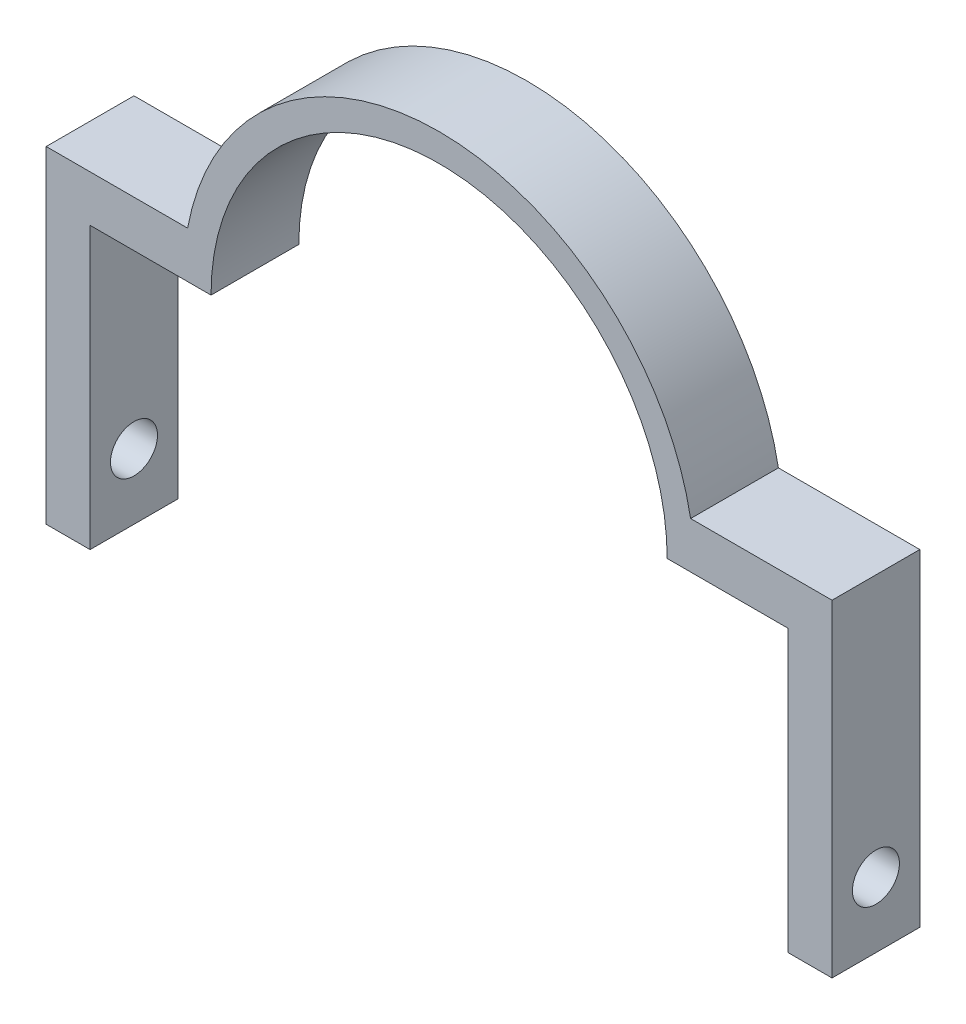
ISO-10303-21;
HEADER;
FILE_DESCRIPTION(('STEP AP214'),'2;1');
FILE_NAME('part.step','',(''),(''),'','','');
FILE_SCHEMA(('AUTOMOTIVE_DESIGN { 1 0 10303 214 1 1 1 1 }'));
ENDSEC;
DATA;
#1=APPLICATION_CONTEXT('core data for automotive mechanical design processes');
#2=APPLICATION_PROTOCOL_DEFINITION('international standard','automotive_design',2000,#1);
#3=PRODUCT_CONTEXT('',#1,'mechanical');
#4=PRODUCT('Part','Part','',(#3));
#5=PRODUCT_RELATED_PRODUCT_CATEGORY('part','',(#4));
#6=PRODUCT_DEFINITION_FORMATION('','',#4);
#7=PRODUCT_DEFINITION_CONTEXT('part definition',#1,'design');
#8=PRODUCT_DEFINITION('design','',#6,#7);
#9=PRODUCT_DEFINITION_SHAPE('','',#8);
#10=(LENGTH_UNIT() NAMED_UNIT(*) SI_UNIT(.MILLI.,.METRE.));
#11=(NAMED_UNIT(*) PLANE_ANGLE_UNIT() SI_UNIT($,.RADIAN.));
#12=(NAMED_UNIT(*) SI_UNIT($,.STERADIAN.) SOLID_ANGLE_UNIT());
#13=UNCERTAINTY_MEASURE_WITH_UNIT(LENGTH_MEASURE(1.E-05),#10,'distance_accuracy_value','');
#14=(GEOMETRIC_REPRESENTATION_CONTEXT(3) GLOBAL_UNCERTAINTY_ASSIGNED_CONTEXT((#13)) GLOBAL_UNIT_ASSIGNED_CONTEXT((#10,
#11,#12)) REPRESENTATION_CONTEXT('',''));
#15=CARTESIAN_POINT('',(0.,0.,0.));
#16=DIRECTION('',(0.,0.,1.));
#17=DIRECTION('',(1.,0.,0.));
#18=AXIS2_PLACEMENT_3D('',#15,#16,#17);
#19=CARTESIAN_POINT('',(-28.4249952,-20.32,6.35));
#20=DIRECTION('',(1.,0.,0.));
#21=DIRECTION('',(0.,1.,0.));
#22=AXIS2_PLACEMENT_3D('',#19,#20,#21);
#23=PLANE('',#22);
#24=CARTESIAN_POINT('',(-28.4249952,-15.5878422506403,3.175));
#25=DIRECTION('',(1.,0.,0.));
#26=DIRECTION('',(0.,1.,0.));
#27=AXIS2_PLACEMENT_3D('',#24,#25,#26);
#28=CIRCLE('',#27,1.700000029);
#29=CARTESIAN_POINT('',(-28.4249952,-13.8878422216403,3.175));
#30=VERTEX_POINT('',#29);
#31=EDGE_CURVE('E265',#30,#30,#28,.T.);
#32=ORIENTED_EDGE('',*,*,#31,.T.);
#33=EDGE_LOOP('',(#32));
#34=FACE_BOUND('',#33,.T.);
#35=DIRECTION('',(0.,-1.,0.));
#36=VECTOR('',#35,1.);
#37=CARTESIAN_POINT('',(-28.4249952,-20.32,0.));
#38=LINE('',#37,#36);
#39=CARTESIAN_POINT('',(-28.4249952,3.35014374935966,0.));
#40=VERTEX_POINT('',#39);
#41=CARTESIAN_POINT('',(-28.4249952,-20.32,0.));
#42=VERTEX_POINT('',#41);
#43=EDGE_CURVE('E157',#40,#42,#38,.T.);
#44=ORIENTED_EDGE('',*,*,#43,.T.);
#45=DIRECTION('',(0.,0.,-1.));
#46=VECTOR('',#45,1.);
#47=CARTESIAN_POINT('',(-28.4249952,-20.32,6.35));
#48=LINE('',#47,#46);
#49=CARTESIAN_POINT('',(-28.4249952,-20.32,6.35));
#50=VERTEX_POINT('',#49);
#51=EDGE_CURVE('E11',#50,#42,#48,.T.);
#52=ORIENTED_EDGE('',*,*,#51,.F.);
#53=DIRECTION('',(0.,-1.,0.));
#54=VECTOR('',#53,1.);
#55=CARTESIAN_POINT('',(-28.4249952,-20.32,6.35));
#56=LINE('',#55,#54);
#57=CARTESIAN_POINT('',(-28.4249952,3.35014374935966,6.35));
#58=VERTEX_POINT('',#57);
#59=EDGE_CURVE('E180',#58,#50,#56,.T.);
#60=ORIENTED_EDGE('',*,*,#59,.F.);
#61=DIRECTION('',(0.,0.,-1.));
#62=VECTOR('',#61,1.);
#63=CARTESIAN_POINT('',(-28.4249952,3.35014374935966,6.35));
#64=LINE('',#63,#62);
#65=EDGE_CURVE('E153',#58,#40,#64,.T.);
#66=ORIENTED_EDGE('',*,*,#65,.T.);
#67=EDGE_LOOP('',(#44,#52,#60,#66));
#68=FACE_BOUND('',#67,.T.);
#69=ADVANCED_FACE('F37',(#34,#68),#23,.F.);
#70=CARTESIAN_POINT('',(-25.2499952,-20.32,6.35));
#71=DIRECTION('',(0.,1.,0.));
#72=DIRECTION('',(0.,0.,1.));
#73=AXIS2_PLACEMENT_3D('',#70,#71,#72);
#74=PLANE('',#73);
#75=DIRECTION('',(1.,0.,0.));
#76=VECTOR('',#75,1.);
#77=CARTESIAN_POINT('',(-25.2499952,-20.32,0.));
#78=LINE('',#77,#76);
#79=CARTESIAN_POINT('',(-25.2499952,-20.32,0.));
#80=VERTEX_POINT('',#79);
#81=EDGE_CURVE('E160',#42,#80,#78,.T.);
#82=ORIENTED_EDGE('',*,*,#81,.T.);
#83=DIRECTION('',(0.,0.,-1.));
#84=VECTOR('',#83,1.);
#85=CARTESIAN_POINT('',(-25.2499952,-20.32,6.35));
#86=LINE('',#85,#84);
#87=CARTESIAN_POINT('',(-25.2499952,-20.32,6.35));
#88=VERTEX_POINT('',#87);
#89=EDGE_CURVE('E45',#88,#80,#86,.T.);
#90=ORIENTED_EDGE('',*,*,#89,.F.);
#91=DIRECTION('',(1.,0.,0.));
#92=VECTOR('',#91,1.);
#93=CARTESIAN_POINT('',(-25.2499952,-20.32,6.35));
#94=LINE('',#93,#92);
#95=EDGE_CURVE('E108',#50,#88,#94,.T.);
#96=ORIENTED_EDGE('',*,*,#95,.F.);
#97=ORIENTED_EDGE('',*,*,#51,.T.);
#98=EDGE_LOOP('',(#82,#90,#96,#97));
#99=FACE_BOUND('',#98,.T.);
#100=ADVANCED_FACE('F258',(#99),#74,.F.);
#101=CARTESIAN_POINT('',(-25.2499952,0.,6.35));
#102=DIRECTION('',(-1.,0.,0.));
#103=DIRECTION('',(0.,-1.,0.));
#104=AXIS2_PLACEMENT_3D('',#101,#102,#103);
#105=PLANE('',#104);
#106=CARTESIAN_POINT('',(-25.2499952,-15.5878422506403,3.175));
#107=DIRECTION('',(-1.,0.,0.));
#108=DIRECTION('',(0.,-1.,0.));
#109=AXIS2_PLACEMENT_3D('',#106,#107,#108);
#110=CIRCLE('',#109,1.700000029);
#111=CARTESIAN_POINT('',(-25.2499952,-17.2878422796403,3.175));
#112=VERTEX_POINT('',#111);
#113=EDGE_CURVE('E161',#112,#112,#110,.T.);
#114=ORIENTED_EDGE('',*,*,#113,.T.);
#115=EDGE_LOOP('',(#114));
#116=FACE_BOUND('',#115,.T.);
#117=DIRECTION('',(0.,1.,0.));
#118=VECTOR('',#117,1.);
#119=CARTESIAN_POINT('',(-25.2499952,0.,0.));
#120=LINE('',#119,#118);
#121=CARTESIAN_POINT('',(-25.2499952,0.,0.));
#122=VERTEX_POINT('',#121);
#123=EDGE_CURVE('E163',#80,#122,#120,.T.);
#124=ORIENTED_EDGE('',*,*,#123,.T.);
#125=DIRECTION('',(0.,0.,-1.));
#126=VECTOR('',#125,1.);
#127=CARTESIAN_POINT('',(-25.2499952,0.,6.35));
#128=LINE('',#127,#126);
#129=CARTESIAN_POINT('',(-25.2499952,0.,6.35));
#130=VERTEX_POINT('',#129);
#131=EDGE_CURVE('E199',#130,#122,#128,.T.);
#132=ORIENTED_EDGE('',*,*,#131,.F.);
#133=DIRECTION('',(0.,1.,0.));
#134=VECTOR('',#133,1.);
#135=CARTESIAN_POINT('',(-25.2499952,0.,6.35));
#136=LINE('',#135,#134);
#137=EDGE_CURVE('E207',#88,#130,#136,.T.);
#138=ORIENTED_EDGE('',*,*,#137,.F.);
#139=ORIENTED_EDGE('',*,*,#89,.T.);
#140=EDGE_LOOP('',(#124,#132,#138,#139));
#141=FACE_BOUND('',#140,.T.);
#142=ADVANCED_FACE('F205',(#116,#141),#105,.F.);
#143=CARTESIAN_POINT('',(-16.5,0.,6.35));
#144=DIRECTION('',(0.,1.,0.));
#145=DIRECTION('',(-1.,0.,0.));
#146=AXIS2_PLACEMENT_3D('',#143,#144,#145);
#147=PLANE('',#146);
#148=DIRECTION('',(1.,0.,0.));
#149=VECTOR('',#148,1.);
#150=CARTESIAN_POINT('',(-16.5,0.,0.));
#151=LINE('',#150,#149);
#152=CARTESIAN_POINT('',(-16.5,0.,0.));
#153=VERTEX_POINT('',#152);
#154=EDGE_CURVE('E165',#122,#153,#151,.T.);
#155=ORIENTED_EDGE('',*,*,#154,.T.);
#156=DIRECTION('',(0.,0.,-1.));
#157=VECTOR('',#156,1.);
#158=CARTESIAN_POINT('',(-16.5,0.,6.35));
#159=LINE('',#158,#157);
#160=CARTESIAN_POINT('',(-16.5,0.,6.35));
#161=VERTEX_POINT('',#160);
#162=EDGE_CURVE('E196',#161,#153,#159,.T.);
#163=ORIENTED_EDGE('',*,*,#162,.F.);
#164=DIRECTION('',(1.,0.,0.));
#165=VECTOR('',#164,1.);
#166=CARTESIAN_POINT('',(-16.5,0.,6.35));
#167=LINE('',#166,#165);
#168=EDGE_CURVE('E225',#130,#161,#167,.T.);
#169=ORIENTED_EDGE('',*,*,#168,.F.);
#170=ORIENTED_EDGE('',*,*,#131,.T.);
#171=EDGE_LOOP('',(#155,#163,#169,#170));
#172=FACE_BOUND('',#171,.T.);
#173=ADVANCED_FACE('F216',(#172),#147,.F.);
#174=CARTESIAN_POINT('',(0.,0.,6.35));
#175=DIRECTION('',(0.,0.,-1.));
#176=DIRECTION('',(-1.,0.,0.));
#177=AXIS2_PLACEMENT_3D('',#174,#175,#176);
#178=CYLINDRICAL_SURFACE('',#177,16.5);
#179=CARTESIAN_POINT('',(0.,0.,0.));
#180=DIRECTION('',(0.,0.,-1.));
#181=DIRECTION('',(1.,0.,0.));
#182=AXIS2_PLACEMENT_3D('',#179,#180,#181);
#183=CIRCLE('',#182,16.5);
#184=CARTESIAN_POINT('',(16.5,0.,0.));
#185=VERTEX_POINT('',#184);
#186=EDGE_CURVE('E167',#153,#185,#183,.T.);
#187=ORIENTED_EDGE('',*,*,#186,.T.);
#188=DIRECTION('',(0.,0.,-1.));
#189=VECTOR('',#188,1.);
#190=CARTESIAN_POINT('',(16.5,0.,6.35));
#191=LINE('',#190,#189);
#192=CARTESIAN_POINT('',(16.5,0.,6.35));
#193=VERTEX_POINT('',#192);
#194=EDGE_CURVE('E193',#193,#185,#191,.T.);
#195=ORIENTED_EDGE('',*,*,#194,.F.);
#196=CARTESIAN_POINT('',(0.,0.,6.35));
#197=DIRECTION('',(0.,0.,-1.));
#198=DIRECTION('',(1.,0.,0.));
#199=AXIS2_PLACEMENT_3D('',#196,#197,#198);
#200=CIRCLE('',#199,16.5);
#201=EDGE_CURVE('E222',#161,#193,#200,.T.);
#202=ORIENTED_EDGE('',*,*,#201,.F.);
#203=ORIENTED_EDGE('',*,*,#162,.T.);
#204=EDGE_LOOP('',(#187,#195,#202,#203));
#205=FACE_BOUND('',#204,.T.);
#206=ADVANCED_FACE('F220',(#205),#178,.F.);
#207=CARTESIAN_POINT('',(16.5,0.,6.35));
#208=DIRECTION('',(0.,1.,0.));
#209=DIRECTION('',(-1.,0.,0.));
#210=AXIS2_PLACEMENT_3D('',#207,#208,#209);
#211=PLANE('',#210);
#212=DIRECTION('',(1.,0.,0.));
#213=VECTOR('',#212,1.);
#214=CARTESIAN_POINT('',(16.5,0.,0.));
#215=LINE('',#214,#213);
#216=CARTESIAN_POINT('',(25.2499952,0.,0.));
#217=VERTEX_POINT('',#216);
#218=EDGE_CURVE('E169',#185,#217,#215,.T.);
#219=ORIENTED_EDGE('',*,*,#218,.T.);
#220=DIRECTION('',(0.,0.,-1.));
#221=VECTOR('',#220,1.);
#222=CARTESIAN_POINT('',(25.2499952,0.,6.35));
#223=LINE('',#222,#221);
#224=CARTESIAN_POINT('',(25.2499952,0.,6.35));
#225=VERTEX_POINT('',#224);
#226=EDGE_CURVE('E190',#225,#217,#223,.T.);
#227=ORIENTED_EDGE('',*,*,#226,.F.);
#228=DIRECTION('',(1.,0.,0.));
#229=VECTOR('',#228,1.);
#230=CARTESIAN_POINT('',(16.5,0.,6.35));
#231=LINE('',#230,#229);
#232=EDGE_CURVE('E224',#193,#225,#231,.T.);
#233=ORIENTED_EDGE('',*,*,#232,.F.);
#234=ORIENTED_EDGE('',*,*,#194,.T.);
#235=EDGE_LOOP('',(#219,#227,#233,#234));
#236=FACE_BOUND('',#235,.T.);
#237=ADVANCED_FACE('F363',(#236),#211,.F.);
#238=CARTESIAN_POINT('',(25.2499952,0.,6.35));
#239=DIRECTION('',(1.,0.,0.));
#240=DIRECTION('',(0.,1.,0.));
#241=AXIS2_PLACEMENT_3D('',#238,#239,#240);
#242=PLANE('',#241);
#243=CARTESIAN_POINT('',(25.2499952,-15.5878422506403,3.175));
#244=DIRECTION('',(1.,0.,0.));
#245=DIRECTION('',(0.,1.,0.));
#246=AXIS2_PLACEMENT_3D('',#243,#244,#245);
#247=CIRCLE('',#246,1.700000029);
#248=CARTESIAN_POINT('',(25.2499952,-13.8878422216403,3.175));
#249=VERTEX_POINT('',#248);
#250=EDGE_CURVE('E267',#249,#249,#247,.T.);
#251=ORIENTED_EDGE('',*,*,#250,.T.);
#252=EDGE_LOOP('',(#251));
#253=FACE_BOUND('',#252,.T.);
#254=DIRECTION('',(0.,-1.,0.));
#255=VECTOR('',#254,1.);
#256=CARTESIAN_POINT('',(25.2499952,0.,0.));
#257=LINE('',#256,#255);
#258=CARTESIAN_POINT('',(25.2499952,-20.32,0.));
#259=VERTEX_POINT('',#258);
#260=EDGE_CURVE('E171',#217,#259,#257,.T.);
#261=ORIENTED_EDGE('',*,*,#260,.T.);
#262=DIRECTION('',(0.,0.,-1.));
#263=VECTOR('',#262,1.);
#264=CARTESIAN_POINT('',(25.2499952,-20.32,6.35));
#265=LINE('',#264,#263);
#266=CARTESIAN_POINT('',(25.2499952,-20.32,6.35));
#267=VERTEX_POINT('',#266);
#268=EDGE_CURVE('E187',#267,#259,#265,.T.);
#269=ORIENTED_EDGE('',*,*,#268,.F.);
#270=DIRECTION('',(0.,-1.,0.));
#271=VECTOR('',#270,1.);
#272=CARTESIAN_POINT('',(25.2499952,0.,6.35));
#273=LINE('',#272,#271);
#274=EDGE_CURVE('E227',#225,#267,#273,.T.);
#275=ORIENTED_EDGE('',*,*,#274,.F.);
#276=ORIENTED_EDGE('',*,*,#226,.T.);
#277=EDGE_LOOP('',(#261,#269,#275,#276));
#278=FACE_BOUND('',#277,.T.);
#279=ADVANCED_FACE('F354',(#253,#278),#242,.F.);
#280=CARTESIAN_POINT('',(25.2499952,-20.32,6.35));
#281=DIRECTION('',(0.,1.,0.));
#282=DIRECTION('',(0.,0.,1.));
#283=AXIS2_PLACEMENT_3D('',#280,#281,#282);
#284=PLANE('',#283);
#285=DIRECTION('',(1.,0.,0.));
#286=VECTOR('',#285,1.);
#287=CARTESIAN_POINT('',(25.2499952,-20.32,0.));
#288=LINE('',#287,#286);
#289=CARTESIAN_POINT('',(28.4249952,-20.32,0.));
#290=VERTEX_POINT('',#289);
#291=EDGE_CURVE('E173',#259,#290,#288,.T.);
#292=ORIENTED_EDGE('',*,*,#291,.T.);
#293=DIRECTION('',(0.,0.,-1.));
#294=VECTOR('',#293,1.);
#295=CARTESIAN_POINT('',(28.4249952,-20.32,6.35));
#296=LINE('',#295,#294);
#297=CARTESIAN_POINT('',(28.4249952,-20.32,6.35));
#298=VERTEX_POINT('',#297);
#299=EDGE_CURVE('E184',#298,#290,#296,.T.);
#300=ORIENTED_EDGE('',*,*,#299,.F.);
#301=DIRECTION('',(1.,0.,0.));
#302=VECTOR('',#301,1.);
#303=CARTESIAN_POINT('',(25.2499952,-20.32,6.35));
#304=LINE('',#303,#302);
#305=EDGE_CURVE('E233',#267,#298,#304,.T.);
#306=ORIENTED_EDGE('',*,*,#305,.F.);
#307=ORIENTED_EDGE('',*,*,#268,.T.);
#308=EDGE_LOOP('',(#292,#300,#306,#307));
#309=FACE_BOUND('',#308,.T.);
#310=ADVANCED_FACE('F239',(#309),#284,.F.);
#311=CARTESIAN_POINT('',(28.4249952,-20.32,6.35));
#312=DIRECTION('',(-1.,0.,0.));
#313=DIRECTION('',(0.,-1.,0.));
#314=AXIS2_PLACEMENT_3D('',#311,#312,#313);
#315=PLANE('',#314);
#316=CARTESIAN_POINT('',(28.4249952,-15.5878422506403,3.175));
#317=DIRECTION('',(1.,0.,0.));
#318=DIRECTION('',(0.,1.,0.));
#319=AXIS2_PLACEMENT_3D('',#316,#317,#318);
#320=CIRCLE('',#319,1.700000029);
#321=CARTESIAN_POINT('',(28.4249952,-13.8878422216403,3.175));
#322=VERTEX_POINT('',#321);
#323=EDGE_CURVE('E268',#322,#322,#320,.T.);
#324=ORIENTED_EDGE('',*,*,#323,.F.);
#325=EDGE_LOOP('',(#324));
#326=FACE_BOUND('',#325,.T.);
#327=DIRECTION('',(0.,1.,0.));
#328=VECTOR('',#327,1.);
#329=CARTESIAN_POINT('',(28.4249952,-20.32,0.));
#330=LINE('',#329,#328);
#331=CARTESIAN_POINT('',(28.4249952,3.35014374935966,0.));
#332=VERTEX_POINT('',#331);
#333=EDGE_CURVE('E175',#290,#332,#330,.T.);
#334=ORIENTED_EDGE('',*,*,#333,.T.);
#335=DIRECTION('',(0.,0.,-1.));
#336=VECTOR('',#335,1.);
#337=CARTESIAN_POINT('',(28.4249952,3.35014374935966,6.35));
#338=LINE('',#337,#336);
#339=CARTESIAN_POINT('',(28.4249952,3.35014374935966,6.35));
#340=VERTEX_POINT('',#339);
#341=EDGE_CURVE('E148',#340,#332,#338,.T.);
#342=ORIENTED_EDGE('',*,*,#341,.F.);
#343=DIRECTION('',(0.,1.,0.));
#344=VECTOR('',#343,1.);
#345=CARTESIAN_POINT('',(28.4249952,-20.32,6.35));
#346=LINE('',#345,#344);
#347=EDGE_CURVE('E139',#298,#340,#346,.T.);
#348=ORIENTED_EDGE('',*,*,#347,.F.);
#349=ORIENTED_EDGE('',*,*,#299,.T.);
#350=EDGE_LOOP('',(#334,#342,#348,#349));
#351=FACE_BOUND('',#350,.T.);
#352=ADVANCED_FACE('F243',(#326,#351),#315,.F.);
#353=CARTESIAN_POINT('',(28.4249952,3.35014374935966,6.35));
#354=DIRECTION('',(0.,-1.,0.));
#355=DIRECTION('',(0.,0.,-1.));
#356=AXIS2_PLACEMENT_3D('',#353,#354,#355);
#357=PLANE('',#356);
#358=DIRECTION('',(-1.,0.,0.));
#359=VECTOR('',#358,1.);
#360=CARTESIAN_POINT('',(28.4249952,3.35014374935966,0.));
#361=LINE('',#360,#359);
#362=CARTESIAN_POINT('',(18.1941346828759,3.35014374935966,0.));
#363=VERTEX_POINT('',#362);
#364=EDGE_CURVE('E147',#332,#363,#361,.T.);
#365=ORIENTED_EDGE('',*,*,#364,.T.);
#366=DIRECTION('',(0.,0.,-1.));
#367=VECTOR('',#366,1.);
#368=CARTESIAN_POINT('',(18.1941346828759,3.35014374935966,6.35));
#369=LINE('',#368,#367);
#370=CARTESIAN_POINT('',(18.1941346828759,3.35014374935966,6.35));
#371=VERTEX_POINT('',#370);
#372=EDGE_CURVE('E144',#371,#363,#369,.T.);
#373=ORIENTED_EDGE('',*,*,#372,.F.);
#374=DIRECTION('',(-1.,0.,0.));
#375=VECTOR('',#374,1.);
#376=CARTESIAN_POINT('',(28.4249952,3.35014374935966,6.35));
#377=LINE('',#376,#375);
#378=EDGE_CURVE('E133',#340,#371,#377,.T.);
#379=ORIENTED_EDGE('',*,*,#378,.F.);
#380=ORIENTED_EDGE('',*,*,#341,.T.);
#381=EDGE_LOOP('',(#365,#373,#379,#380));
#382=FACE_BOUND('',#381,.T.);
#383=ADVANCED_FACE('F145',(#382),#357,.F.);
#384=CARTESIAN_POINT('',(0.,0.,6.35));
#385=DIRECTION('',(0.,0.,-1.));
#386=DIRECTION('',(-1.,0.,0.));
#387=AXIS2_PLACEMENT_3D('',#384,#385,#386);
#388=CYLINDRICAL_SURFACE('',#387,18.5);
#389=CARTESIAN_POINT('',(0.,0.,0.));
#390=DIRECTION('',(0.,0.,1.));
#391=DIRECTION('',(1.,0.,0.));
#392=AXIS2_PLACEMENT_3D('',#389,#390,#391);
#393=CIRCLE('',#392,18.5);
#394=CARTESIAN_POINT('',(-18.1941346828759,3.35014374935966,0.));
#395=VERTEX_POINT('',#394);
#396=EDGE_CURVE('E94',#363,#395,#393,.T.);
#397=ORIENTED_EDGE('',*,*,#396,.T.);
#398=DIRECTION('',(0.,0.,-1.));
#399=VECTOR('',#398,1.);
#400=CARTESIAN_POINT('',(-18.1941346828759,3.35014374935966,6.35));
#401=LINE('',#400,#399);
#402=CARTESIAN_POINT('',(-18.1941346828759,3.35014374935966,6.35));
#403=VERTEX_POINT('',#402);
#404=EDGE_CURVE('E149',#403,#395,#401,.T.);
#405=ORIENTED_EDGE('',*,*,#404,.F.);
#406=CARTESIAN_POINT('',(0.,0.,6.35));
#407=DIRECTION('',(0.,0.,1.));
#408=DIRECTION('',(1.,0.,0.));
#409=AXIS2_PLACEMENT_3D('',#406,#407,#408);
#410=CIRCLE('',#409,18.5);
#411=EDGE_CURVE('E137',#371,#403,#410,.T.);
#412=ORIENTED_EDGE('',*,*,#411,.F.);
#413=ORIENTED_EDGE('',*,*,#372,.T.);
#414=EDGE_LOOP('',(#397,#405,#412,#413));
#415=FACE_BOUND('',#414,.T.);
#416=ADVANCED_FACE('F151',(#415),#388,.T.);
#417=CARTESIAN_POINT('',(-28.4249952,3.35014374935966,6.35));
#418=DIRECTION('',(0.,-1.,0.));
#419=DIRECTION('',(0.,0.,-1.));
#420=AXIS2_PLACEMENT_3D('',#417,#418,#419);
#421=PLANE('',#420);
#422=DIRECTION('',(-1.,0.,0.));
#423=VECTOR('',#422,1.);
#424=CARTESIAN_POINT('',(-28.4249952,3.35014374935966,0.));
#425=LINE('',#424,#423);
#426=EDGE_CURVE('E100',#395,#40,#425,.T.);
#427=ORIENTED_EDGE('',*,*,#426,.T.);
#428=ORIENTED_EDGE('',*,*,#65,.F.);
#429=DIRECTION('',(-1.,0.,0.));
#430=VECTOR('',#429,1.);
#431=CARTESIAN_POINT('',(-28.4249952,3.35014374935966,6.35));
#432=LINE('',#431,#430);
#433=EDGE_CURVE('E53',#403,#58,#432,.T.);
#434=ORIENTED_EDGE('',*,*,#433,.F.);
#435=ORIENTED_EDGE('',*,*,#404,.T.);
#436=EDGE_LOOP('',(#427,#428,#434,#435));
#437=FACE_BOUND('',#436,.T.);
#438=ADVANCED_FACE('F247',(#437),#421,.F.);
#439=CARTESIAN_POINT('',(0.,0.,6.35));
#440=DIRECTION('',(0.,0.,1.));
#441=DIRECTION('',(1.,0.,0.));
#442=AXIS2_PLACEMENT_3D('',#439,#440,#441);
#443=PLANE('',#442);
#444=ORIENTED_EDGE('',*,*,#59,.T.);
#445=ORIENTED_EDGE('',*,*,#95,.T.);
#446=ORIENTED_EDGE('',*,*,#137,.T.);
#447=ORIENTED_EDGE('',*,*,#168,.T.);
#448=ORIENTED_EDGE('',*,*,#201,.T.);
#449=ORIENTED_EDGE('',*,*,#232,.T.);
#450=ORIENTED_EDGE('',*,*,#274,.T.);
#451=ORIENTED_EDGE('',*,*,#305,.T.);
#452=ORIENTED_EDGE('',*,*,#347,.T.);
#453=ORIENTED_EDGE('',*,*,#378,.T.);
#454=ORIENTED_EDGE('',*,*,#411,.T.);
#455=ORIENTED_EDGE('',*,*,#433,.T.);
#456=EDGE_LOOP('',(#444,#445,#446,#447,#448,#449,#450,#451,#452,#453,#454,#455));
#457=FACE_BOUND('',#456,.T.);
#458=ADVANCED_FACE('F135',(#457),#443,.T.);
#459=CARTESIAN_POINT('',(0.,0.,0.));
#460=DIRECTION('',(0.,0.,1.));
#461=DIRECTION('',(1.,0.,0.));
#462=AXIS2_PLACEMENT_3D('',#459,#460,#461);
#463=PLANE('',#462);
#464=ORIENTED_EDGE('',*,*,#43,.F.);
#465=ORIENTED_EDGE('',*,*,#426,.F.);
#466=ORIENTED_EDGE('',*,*,#396,.F.);
#467=ORIENTED_EDGE('',*,*,#364,.F.);
#468=ORIENTED_EDGE('',*,*,#333,.F.);
#469=ORIENTED_EDGE('',*,*,#291,.F.);
#470=ORIENTED_EDGE('',*,*,#260,.F.);
#471=ORIENTED_EDGE('',*,*,#218,.F.);
#472=ORIENTED_EDGE('',*,*,#186,.F.);
#473=ORIENTED_EDGE('',*,*,#154,.F.);
#474=ORIENTED_EDGE('',*,*,#123,.F.);
#475=ORIENTED_EDGE('',*,*,#81,.F.);
#476=EDGE_LOOP('',(#464,#465,#466,#467,#468,#469,#470,#471,#472,#473,#474,#475));
#477=FACE_BOUND('',#476,.T.);
#478=ADVANCED_FACE('F211',(#477),#463,.F.);
#479=CARTESIAN_POINT('',(-28.4249952,-15.5878422506403,3.175));
#480=DIRECTION('',(1.,0.,0.));
#481=DIRECTION('',(0.,1.,0.));
#482=AXIS2_PLACEMENT_3D('',#479,#480,#481);
#483=CYLINDRICAL_SURFACE('',#482,1.700000029);
#484=ORIENTED_EDGE('',*,*,#323,.T.);
#485=EDGE_LOOP('',(#484));
#486=FACE_BOUND('',#485,.T.);
#487=ORIENTED_EDGE('',*,*,#250,.F.);
#488=EDGE_LOOP('',(#487));
#489=FACE_BOUND('',#488,.T.);
#490=ADVANCED_FACE('F283',(#486,#489),#483,.F.);
#491=ORIENTED_EDGE('',*,*,#31,.F.);
#492=EDGE_LOOP('',(#491));
#493=FACE_BOUND('',#492,.T.);
#494=ORIENTED_EDGE('',*,*,#113,.F.);
#495=EDGE_LOOP('',(#494));
#496=FACE_BOUND('',#495,.T.);
#497=ADVANCED_FACE('F281',(#493,#496),#483,.F.);
#498=CLOSED_SHELL('',(#69,#100,#142,#173,#206,#237,#279,#310,#352,#383,#416,#438,#458,#478,#490,#497));
#499=MANIFOLD_SOLID_BREP('B2',#498);
#500=ADVANCED_BREP_SHAPE_REPRESENTATION('',(#18,#499),#14);
#501=SHAPE_DEFINITION_REPRESENTATION(#9,#500);
ENDSEC;
END-ISO-10303-21;
